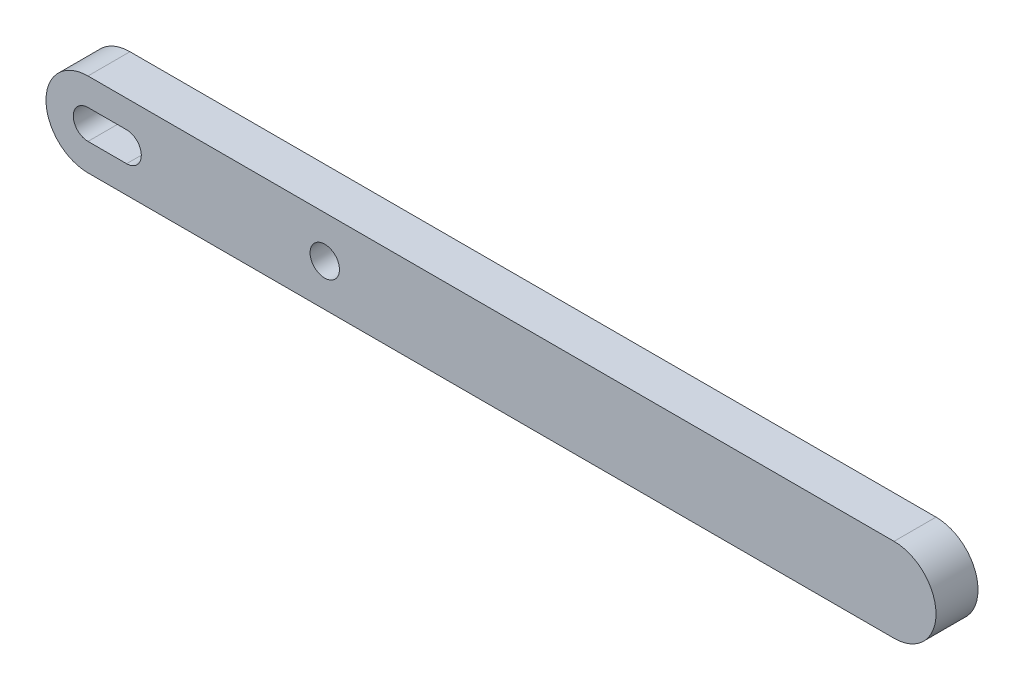
ISO-10303-21;
HEADER;
FILE_DESCRIPTION(('STEP AP214'),'2;1');
FILE_NAME('part.step','',(''),(''),'','','');
FILE_SCHEMA(('AUTOMOTIVE_DESIGN { 1 0 10303 214 1 1 1 1 }'));
ENDSEC;
DATA;
#1=APPLICATION_CONTEXT('core data for automotive mechanical design processes');
#2=APPLICATION_PROTOCOL_DEFINITION('international standard','automotive_design',2000,#1);
#3=PRODUCT_CONTEXT('',#1,'mechanical');
#4=PRODUCT('Part','Part','',(#3));
#5=PRODUCT_RELATED_PRODUCT_CATEGORY('part','',(#4));
#6=PRODUCT_DEFINITION_FORMATION('','',#4);
#7=PRODUCT_DEFINITION_CONTEXT('part definition',#1,'design');
#8=PRODUCT_DEFINITION('design','',#6,#7);
#9=PRODUCT_DEFINITION_SHAPE('','',#8);
#10=(LENGTH_UNIT() NAMED_UNIT(*) SI_UNIT(.MILLI.,.METRE.));
#11=(NAMED_UNIT(*) PLANE_ANGLE_UNIT() SI_UNIT($,.RADIAN.));
#12=(NAMED_UNIT(*) SI_UNIT($,.STERADIAN.) SOLID_ANGLE_UNIT());
#13=UNCERTAINTY_MEASURE_WITH_UNIT(LENGTH_MEASURE(1.E-05),#10,'distance_accuracy_value','');
#14=(GEOMETRIC_REPRESENTATION_CONTEXT(3) GLOBAL_UNCERTAINTY_ASSIGNED_CONTEXT((#13)) GLOBAL_UNIT_ASSIGNED_CONTEXT((#10,
#11,#12)) REPRESENTATION_CONTEXT('',''));
#15=CARTESIAN_POINT('',(0.,0.,0.));
#16=DIRECTION('',(0.,0.,1.));
#17=DIRECTION('',(1.,0.,0.));
#18=AXIS2_PLACEMENT_3D('',#15,#16,#17);
#19=CARTESIAN_POINT('',(0.,0.,5.));
#20=DIRECTION('',(0.,0.,1.));
#21=DIRECTION('',(1.,0.,0.));
#22=AXIS2_PLACEMENT_3D('',#19,#20,#21);
#23=PLANE('',#22);
#24=DIRECTION('',(1.,0.,0.));
#25=VECTOR('',#24,1.);
#26=CARTESIAN_POINT('',(-96.,-1.75,5.));
#27=LINE('',#26,#25);
#28=CARTESIAN_POINT('',(-96.,-1.75,5.));
#29=VERTEX_POINT('',#28);
#30=CARTESIAN_POINT('',(-91.4,-1.75,5.));
#31=VERTEX_POINT('',#30);
#32=EDGE_CURVE('E120',#29,#31,#27,.T.);
#33=ORIENTED_EDGE('',*,*,#32,.F.);
#34=CARTESIAN_POINT('',(-96.,0.,5.));
#35=DIRECTION('',(0.,0.,1.));
#36=DIRECTION('',(1.,0.,0.));
#37=AXIS2_PLACEMENT_3D('',#34,#35,#36);
#38=CIRCLE('',#37,1.75);
#39=CARTESIAN_POINT('',(-96.,1.75,5.));
#40=VERTEX_POINT('',#39);
#41=EDGE_CURVE('E111',#40,#29,#38,.T.);
#42=ORIENTED_EDGE('',*,*,#41,.F.);
#43=DIRECTION('',(-1.,0.,0.));
#44=VECTOR('',#43,1.);
#45=CARTESIAN_POINT('',(-96.,1.75,5.));
#46=LINE('',#45,#44);
#47=CARTESIAN_POINT('',(-91.4,1.75,5.));
#48=VERTEX_POINT('',#47);
#49=EDGE_CURVE('E138',#48,#40,#46,.T.);
#50=ORIENTED_EDGE('',*,*,#49,.F.);
#51=CARTESIAN_POINT('',(-91.4,0.,5.));
#52=DIRECTION('',(0.,0.,1.));
#53=DIRECTION('',(1.,0.,0.));
#54=AXIS2_PLACEMENT_3D('',#51,#52,#53);
#55=CIRCLE('',#54,1.75);
#56=EDGE_CURVE('E134',#31,#48,#55,.T.);
#57=ORIENTED_EDGE('',*,*,#56,.F.);
#58=EDGE_LOOP('',(#33,#42,#50,#57));
#59=FACE_BOUND('',#58,.T.);
#60=CARTESIAN_POINT('',(0.,0.,5.));
#61=DIRECTION('',(0.,0.,1.));
#62=DIRECTION('',(1.,0.,0.));
#63=AXIS2_PLACEMENT_3D('',#60,#61,#62);
#64=CIRCLE('',#63,5.);
#65=CARTESIAN_POINT('',(0.,-5.,5.));
#66=VERTEX_POINT('',#65);
#67=CARTESIAN_POINT('',(0.,5.,5.));
#68=VERTEX_POINT('',#67);
#69=EDGE_CURVE('E162',#66,#68,#64,.T.);
#70=ORIENTED_EDGE('',*,*,#69,.T.);
#71=DIRECTION('',(-1.,0.,0.));
#72=VECTOR('',#71,1.);
#73=CARTESIAN_POINT('',(0.,5.,5.));
#74=LINE('',#73,#72);
#75=CARTESIAN_POINT('',(-96.,5.,5.));
#76=VERTEX_POINT('',#75);
#77=EDGE_CURVE('E166',#68,#76,#74,.T.);
#78=ORIENTED_EDGE('',*,*,#77,.T.);
#79=CARTESIAN_POINT('',(-96.,0.,5.));
#80=DIRECTION('',(0.,0.,1.));
#81=DIRECTION('',(1.,0.,0.));
#82=AXIS2_PLACEMENT_3D('',#79,#80,#81);
#83=CIRCLE('',#82,5.);
#84=CARTESIAN_POINT('',(-96.,-5.,5.));
#85=VERTEX_POINT('',#84);
#86=EDGE_CURVE('E170',#76,#85,#83,.T.);
#87=ORIENTED_EDGE('',*,*,#86,.T.);
#88=DIRECTION('',(1.,0.,0.));
#89=VECTOR('',#88,1.);
#90=CARTESIAN_POINT('',(0.,-5.,5.));
#91=LINE('',#90,#89);
#92=EDGE_CURVE('E173',#85,#66,#91,.T.);
#93=ORIENTED_EDGE('',*,*,#92,.T.);
#94=EDGE_LOOP('',(#70,#78,#87,#93));
#95=FACE_BOUND('',#94,.T.);
#96=CARTESIAN_POINT('',(-67.8,0.,5.));
#97=DIRECTION('',(0.,0.,1.));
#98=DIRECTION('',(1.,0.,0.));
#99=AXIS2_PLACEMENT_3D('',#96,#97,#98);
#100=CIRCLE('',#99,1.75);
#101=CARTESIAN_POINT('',(-66.05,0.,5.));
#102=VERTEX_POINT('',#101);
#103=EDGE_CURVE('E146',#102,#102,#100,.T.);
#104=ORIENTED_EDGE('',*,*,#103,.F.);
#105=EDGE_LOOP('',(#104));
#106=FACE_BOUND('',#105,.T.);
#107=ADVANCED_FACE('F45',(#59,#95,#106),#23,.T.);
#108=CARTESIAN_POINT('',(0.,0.,0.));
#109=DIRECTION('',(0.,0.,1.));
#110=DIRECTION('',(1.,0.,0.));
#111=AXIS2_PLACEMENT_3D('',#108,#109,#110);
#112=PLANE('',#111);
#113=CARTESIAN_POINT('',(0.,0.,0.));
#114=DIRECTION('',(0.,0.,1.));
#115=DIRECTION('',(1.,0.,0.));
#116=AXIS2_PLACEMENT_3D('',#113,#114,#115);
#117=CIRCLE('',#116,5.);
#118=CARTESIAN_POINT('',(0.,-5.,0.));
#119=VERTEX_POINT('',#118);
#120=CARTESIAN_POINT('',(0.,5.,0.));
#121=VERTEX_POINT('',#120);
#122=EDGE_CURVE('E129',#119,#121,#117,.T.);
#123=ORIENTED_EDGE('',*,*,#122,.F.);
#124=DIRECTION('',(1.,0.,0.));
#125=VECTOR('',#124,1.);
#126=CARTESIAN_POINT('',(0.,-5.,0.));
#127=LINE('',#126,#125);
#128=CARTESIAN_POINT('',(-96.,-5.,0.));
#129=VERTEX_POINT('',#128);
#130=EDGE_CURVE('E167',#129,#119,#127,.T.);
#131=ORIENTED_EDGE('',*,*,#130,.F.);
#132=CARTESIAN_POINT('',(-96.,0.,0.));
#133=DIRECTION('',(0.,0.,1.));
#134=DIRECTION('',(1.,0.,0.));
#135=AXIS2_PLACEMENT_3D('',#132,#133,#134);
#136=CIRCLE('',#135,5.);
#137=CARTESIAN_POINT('',(-96.,5.,0.));
#138=VERTEX_POINT('',#137);
#139=EDGE_CURVE('E183',#138,#129,#136,.T.);
#140=ORIENTED_EDGE('',*,*,#139,.F.);
#141=DIRECTION('',(-1.,0.,0.));
#142=VECTOR('',#141,1.);
#143=CARTESIAN_POINT('',(0.,5.,0.));
#144=LINE('',#143,#142);
#145=EDGE_CURVE('E180',#121,#138,#144,.T.);
#146=ORIENTED_EDGE('',*,*,#145,.F.);
#147=EDGE_LOOP('',(#123,#131,#140,#146));
#148=FACE_BOUND('',#147,.T.);
#149=CARTESIAN_POINT('',(-96.,0.,0.));
#150=DIRECTION('',(0.,0.,1.));
#151=DIRECTION('',(1.,0.,0.));
#152=AXIS2_PLACEMENT_3D('',#149,#150,#151);
#153=CIRCLE('',#152,1.75);
#154=CARTESIAN_POINT('',(-96.,1.75,0.));
#155=VERTEX_POINT('',#154);
#156=CARTESIAN_POINT('',(-96.,-1.75,0.));
#157=VERTEX_POINT('',#156);
#158=EDGE_CURVE('E69',#155,#157,#153,.T.);
#159=ORIENTED_EDGE('',*,*,#158,.T.);
#160=DIRECTION('',(1.,0.,0.));
#161=VECTOR('',#160,1.);
#162=CARTESIAN_POINT('',(-96.,-1.75,0.));
#163=LINE('',#162,#161);
#164=CARTESIAN_POINT('',(-91.4,-1.75,0.));
#165=VERTEX_POINT('',#164);
#166=EDGE_CURVE('E127',#157,#165,#163,.T.);
#167=ORIENTED_EDGE('',*,*,#166,.T.);
#168=CARTESIAN_POINT('',(-91.4,0.,0.));
#169=DIRECTION('',(0.,0.,1.));
#170=DIRECTION('',(1.,0.,0.));
#171=AXIS2_PLACEMENT_3D('',#168,#169,#170);
#172=CIRCLE('',#171,1.75);
#173=CARTESIAN_POINT('',(-91.4,1.75,0.));
#174=VERTEX_POINT('',#173);
#175=EDGE_CURVE('E149',#165,#174,#172,.T.);
#176=ORIENTED_EDGE('',*,*,#175,.T.);
#177=DIRECTION('',(-1.,0.,0.));
#178=VECTOR('',#177,1.);
#179=CARTESIAN_POINT('',(-96.,1.75,0.));
#180=LINE('',#179,#178);
#181=EDGE_CURVE('E121',#174,#155,#180,.T.);
#182=ORIENTED_EDGE('',*,*,#181,.T.);
#183=EDGE_LOOP('',(#159,#167,#176,#182));
#184=FACE_BOUND('',#183,.T.);
#185=CARTESIAN_POINT('',(-67.8,0.,0.));
#186=DIRECTION('',(0.,0.,1.));
#187=DIRECTION('',(1.,0.,0.));
#188=AXIS2_PLACEMENT_3D('',#185,#186,#187);
#189=CIRCLE('',#188,1.75);
#190=CARTESIAN_POINT('',(-66.05,0.,0.));
#191=VERTEX_POINT('',#190);
#192=EDGE_CURVE('E259',#191,#191,#189,.T.);
#193=ORIENTED_EDGE('',*,*,#192,.T.);
#194=EDGE_LOOP('',(#193));
#195=FACE_BOUND('',#194,.T.);
#196=ADVANCED_FACE('F206',(#148,#184,#195),#112,.F.);
#197=CARTESIAN_POINT('',(0.,0.,5.));
#198=DIRECTION('',(0.,0.,-1.));
#199=DIRECTION('',(-1.,0.,0.));
#200=AXIS2_PLACEMENT_3D('',#197,#198,#199);
#201=CYLINDRICAL_SURFACE('',#200,5.);
#202=ORIENTED_EDGE('',*,*,#122,.T.);
#203=DIRECTION('',(0.,0.,-1.));
#204=VECTOR('',#203,1.);
#205=CARTESIAN_POINT('',(0.,5.,5.));
#206=LINE('',#205,#204);
#207=EDGE_CURVE('E11',#68,#121,#206,.T.);
#208=ORIENTED_EDGE('',*,*,#207,.F.);
#209=ORIENTED_EDGE('',*,*,#69,.F.);
#210=DIRECTION('',(0.,0.,-1.));
#211=VECTOR('',#210,1.);
#212=CARTESIAN_POINT('',(0.,-5.,5.));
#213=LINE('',#212,#211);
#214=EDGE_CURVE('E176',#66,#119,#213,.T.);
#215=ORIENTED_EDGE('',*,*,#214,.T.);
#216=EDGE_LOOP('',(#202,#208,#209,#215));
#217=FACE_BOUND('',#216,.T.);
#218=ADVANCED_FACE('F47',(#217),#201,.T.);
#219=CARTESIAN_POINT('',(0.,5.,5.));
#220=DIRECTION('',(0.,-1.,0.));
#221=DIRECTION('',(1.,0.,0.));
#222=AXIS2_PLACEMENT_3D('',#219,#220,#221);
#223=PLANE('',#222);
#224=ORIENTED_EDGE('',*,*,#145,.T.);
#225=DIRECTION('',(0.,0.,-1.));
#226=VECTOR('',#225,1.);
#227=CARTESIAN_POINT('',(-96.,5.,5.));
#228=LINE('',#227,#226);
#229=EDGE_CURVE('E54',#76,#138,#228,.T.);
#230=ORIENTED_EDGE('',*,*,#229,.F.);
#231=ORIENTED_EDGE('',*,*,#77,.F.);
#232=ORIENTED_EDGE('',*,*,#207,.T.);
#233=EDGE_LOOP('',(#224,#230,#231,#232));
#234=FACE_BOUND('',#233,.T.);
#235=ADVANCED_FACE('F216',(#234),#223,.F.);
#236=CARTESIAN_POINT('',(-96.,0.,5.));
#237=DIRECTION('',(0.,0.,-1.));
#238=DIRECTION('',(-1.,0.,0.));
#239=AXIS2_PLACEMENT_3D('',#236,#237,#238);
#240=CYLINDRICAL_SURFACE('',#239,5.);
#241=ORIENTED_EDGE('',*,*,#139,.T.);
#242=DIRECTION('',(0.,0.,-1.));
#243=VECTOR('',#242,1.);
#244=CARTESIAN_POINT('',(-96.,-5.,5.));
#245=LINE('',#244,#243);
#246=EDGE_CURVE('E191',#85,#129,#245,.T.);
#247=ORIENTED_EDGE('',*,*,#246,.F.);
#248=ORIENTED_EDGE('',*,*,#86,.F.);
#249=ORIENTED_EDGE('',*,*,#229,.T.);
#250=EDGE_LOOP('',(#241,#247,#248,#249));
#251=FACE_BOUND('',#250,.T.);
#252=ADVANCED_FACE('F200',(#251),#240,.T.);
#253=CARTESIAN_POINT('',(0.,-5.,5.));
#254=DIRECTION('',(0.,1.,0.));
#255=DIRECTION('',(-1.,0.,0.));
#256=AXIS2_PLACEMENT_3D('',#253,#254,#255);
#257=PLANE('',#256);
#258=ORIENTED_EDGE('',*,*,#130,.T.);
#259=ORIENTED_EDGE('',*,*,#214,.F.);
#260=ORIENTED_EDGE('',*,*,#92,.F.);
#261=ORIENTED_EDGE('',*,*,#246,.T.);
#262=EDGE_LOOP('',(#258,#259,#260,#261));
#263=FACE_BOUND('',#262,.T.);
#264=ADVANCED_FACE('F210',(#263),#257,.F.);
#265=CARTESIAN_POINT('',(-96.,0.,5.));
#266=DIRECTION('',(0.,0.,-1.));
#267=DIRECTION('',(-1.,0.,0.));
#268=AXIS2_PLACEMENT_3D('',#265,#266,#267);
#269=CYLINDRICAL_SURFACE('',#268,1.75);
#270=ORIENTED_EDGE('',*,*,#158,.F.);
#271=DIRECTION('',(0.,0.,-1.));
#272=VECTOR('',#271,1.);
#273=CARTESIAN_POINT('',(-96.,1.75,5.));
#274=LINE('',#273,#272);
#275=EDGE_CURVE('E115',#40,#155,#274,.T.);
#276=ORIENTED_EDGE('',*,*,#275,.F.);
#277=ORIENTED_EDGE('',*,*,#41,.T.);
#278=DIRECTION('',(0.,0.,-1.));
#279=VECTOR('',#278,1.);
#280=CARTESIAN_POINT('',(-96.,-1.75,5.));
#281=LINE('',#280,#279);
#282=EDGE_CURVE('E114',#29,#157,#281,.T.);
#283=ORIENTED_EDGE('',*,*,#282,.T.);
#284=EDGE_LOOP('',(#270,#276,#277,#283));
#285=FACE_BOUND('',#284,.T.);
#286=ADVANCED_FACE('F113',(#285),#269,.F.);
#287=CARTESIAN_POINT('',(-96.,-1.75,5.));
#288=DIRECTION('',(0.,1.,0.));
#289=DIRECTION('',(-1.,0.,0.));
#290=AXIS2_PLACEMENT_3D('',#287,#288,#289);
#291=PLANE('',#290);
#292=ORIENTED_EDGE('',*,*,#166,.F.);
#293=ORIENTED_EDGE('',*,*,#282,.F.);
#294=ORIENTED_EDGE('',*,*,#32,.T.);
#295=DIRECTION('',(0.,0.,-1.));
#296=VECTOR('',#295,1.);
#297=CARTESIAN_POINT('',(-91.4,-1.75,5.));
#298=LINE('',#297,#296);
#299=EDGE_CURVE('E130',#31,#165,#298,.T.);
#300=ORIENTED_EDGE('',*,*,#299,.T.);
#301=EDGE_LOOP('',(#292,#293,#294,#300));
#302=FACE_BOUND('',#301,.T.);
#303=ADVANCED_FACE('F124',(#302),#291,.T.);
#304=CARTESIAN_POINT('',(-91.4,0.,5.));
#305=DIRECTION('',(0.,0.,-1.));
#306=DIRECTION('',(-1.,0.,0.));
#307=AXIS2_PLACEMENT_3D('',#304,#305,#306);
#308=CYLINDRICAL_SURFACE('',#307,1.75);
#309=ORIENTED_EDGE('',*,*,#175,.F.);
#310=ORIENTED_EDGE('',*,*,#299,.F.);
#311=ORIENTED_EDGE('',*,*,#56,.T.);
#312=DIRECTION('',(0.,0.,-1.));
#313=VECTOR('',#312,1.);
#314=CARTESIAN_POINT('',(-91.4,1.75,5.));
#315=LINE('',#314,#313);
#316=EDGE_CURVE('E61',#48,#174,#315,.T.);
#317=ORIENTED_EDGE('',*,*,#316,.T.);
#318=EDGE_LOOP('',(#309,#310,#311,#317));
#319=FACE_BOUND('',#318,.T.);
#320=ADVANCED_FACE('F239',(#319),#308,.F.);
#321=CARTESIAN_POINT('',(-96.,1.75,5.));
#322=DIRECTION('',(0.,-1.,0.));
#323=DIRECTION('',(1.,0.,0.));
#324=AXIS2_PLACEMENT_3D('',#321,#322,#323);
#325=PLANE('',#324);
#326=ORIENTED_EDGE('',*,*,#181,.F.);
#327=ORIENTED_EDGE('',*,*,#316,.F.);
#328=ORIENTED_EDGE('',*,*,#49,.T.);
#329=ORIENTED_EDGE('',*,*,#275,.T.);
#330=EDGE_LOOP('',(#326,#327,#328,#329));
#331=FACE_BOUND('',#330,.T.);
#332=ADVANCED_FACE('F243',(#331),#325,.T.);
#333=CARTESIAN_POINT('',(-67.8,0.,5.));
#334=DIRECTION('',(0.,0.,-1.));
#335=DIRECTION('',(-1.,0.,0.));
#336=AXIS2_PLACEMENT_3D('',#333,#334,#335);
#337=CYLINDRICAL_SURFACE('',#336,1.75);
#338=ORIENTED_EDGE('',*,*,#103,.T.);
#339=EDGE_LOOP('',(#338));
#340=FACE_BOUND('',#339,.T.);
#341=ORIENTED_EDGE('',*,*,#192,.F.);
#342=EDGE_LOOP('',(#341));
#343=FACE_BOUND('',#342,.T.);
#344=ADVANCED_FACE('F249',(#340,#343),#337,.F.);
#345=CLOSED_SHELL('',(#107,#196,#218,#235,#252,#264,#286,#303,#320,#332,#344));
#346=MANIFOLD_SOLID_BREP('B2',#345);
#347=ADVANCED_BREP_SHAPE_REPRESENTATION('',(#18,#346),#14);
#348=SHAPE_DEFINITION_REPRESENTATION(#9,#347);
ENDSEC;
END-ISO-10303-21;
